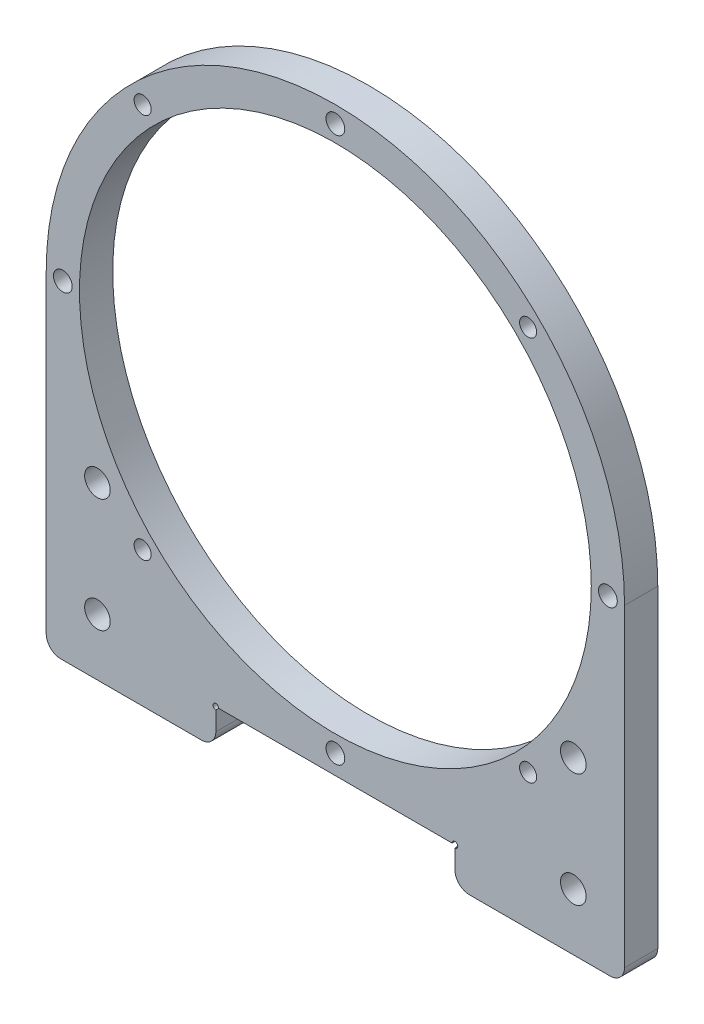
ISO-10303-21;
HEADER;
FILE_DESCRIPTION(('STEP AP214'),'2;1');
FILE_NAME('part.step','',(''),(''),'','','');
FILE_SCHEMA(('AUTOMOTIVE_DESIGN { 1 0 10303 214 1 1 1 1 }'));
ENDSEC;
DATA;
#1=APPLICATION_CONTEXT('core data for automotive mechanical design processes');
#2=APPLICATION_PROTOCOL_DEFINITION('international standard','automotive_design',2000,#1);
#3=PRODUCT_CONTEXT('',#1,'mechanical');
#4=PRODUCT('Part','Part','',(#3));
#5=PRODUCT_RELATED_PRODUCT_CATEGORY('part','',(#4));
#6=PRODUCT_DEFINITION_FORMATION('','',#4);
#7=PRODUCT_DEFINITION_CONTEXT('part definition',#1,'design');
#8=PRODUCT_DEFINITION('design','',#6,#7);
#9=PRODUCT_DEFINITION_SHAPE('','',#8);
#10=(LENGTH_UNIT() NAMED_UNIT(*) SI_UNIT(.MILLI.,.METRE.));
#11=(NAMED_UNIT(*) PLANE_ANGLE_UNIT() SI_UNIT($,.RADIAN.));
#12=(NAMED_UNIT(*) SI_UNIT($,.STERADIAN.) SOLID_ANGLE_UNIT());
#13=UNCERTAINTY_MEASURE_WITH_UNIT(LENGTH_MEASURE(1.E-05),#10,'distance_accuracy_value','');
#14=(GEOMETRIC_REPRESENTATION_CONTEXT(3) GLOBAL_UNCERTAINTY_ASSIGNED_CONTEXT((#13)) GLOBAL_UNIT_ASSIGNED_CONTEXT((#10,
#11,#12)) REPRESENTATION_CONTEXT('',''));
#15=CARTESIAN_POINT('',(0.,0.,0.));
#16=DIRECTION('',(0.,0.,1.));
#17=DIRECTION('',(1.,0.,0.));
#18=AXIS2_PLACEMENT_3D('',#15,#16,#17);
#19=CARTESIAN_POINT('',(0.,-57.658,5.842));
#20=DIRECTION('',(0.,1.,0.));
#21=DIRECTION('',(-1.,0.,0.));
#22=AXIS2_PLACEMENT_3D('',#19,#20,#21);
#23=PLANE('',#22);
#24=DIRECTION('',(1.,0.,0.));
#25=VECTOR('',#24,1.);
#26=CARTESIAN_POINT('',(0.,-57.658,0.));
#27=LINE('',#26,#25);
#28=CARTESIAN_POINT('',(-48.26,-57.658,0.));
#29=VERTEX_POINT('',#28);
#30=CARTESIAN_POINT('',(-23.54,-57.658,0.));
#31=VERTEX_POINT('',#30);
#32=EDGE_CURVE('E263',#29,#31,#27,.T.);
#33=ORIENTED_EDGE('',*,*,#32,.T.);
#34=DIRECTION('',(0.,0.,1.));
#35=VECTOR('',#34,1.);
#36=CARTESIAN_POINT('',(-23.54,-57.658,5.842));
#37=LINE('',#36,#35);
#38=CARTESIAN_POINT('',(-23.54,-57.658,5.842));
#39=VERTEX_POINT('',#38);
#40=EDGE_CURVE('E309',#31,#39,#37,.T.);
#41=ORIENTED_EDGE('',*,*,#40,.T.);
#42=DIRECTION('',(1.,0.,0.));
#43=VECTOR('',#42,1.);
#44=CARTESIAN_POINT('',(0.,-57.658,5.842));
#45=LINE('',#44,#43);
#46=CARTESIAN_POINT('',(-48.26,-57.658,5.842));
#47=VERTEX_POINT('',#46);
#48=EDGE_CURVE('E209',#47,#39,#45,.T.);
#49=ORIENTED_EDGE('',*,*,#48,.F.);
#50=DIRECTION('',(0.,0.,-1.));
#51=VECTOR('',#50,1.);
#52=CARTESIAN_POINT('',(-48.26,-57.658,5.842));
#53=LINE('',#52,#51);
#54=EDGE_CURVE('E306',#47,#29,#53,.T.);
#55=ORIENTED_EDGE('',*,*,#54,.T.);
#56=EDGE_LOOP('',(#33,#41,#49,#55));
#57=FACE_BOUND('',#56,.T.);
#58=ADVANCED_FACE('F35',(#57),#23,.F.);
#59=CARTESIAN_POINT('',(0.,0.,5.842));
#60=DIRECTION('',(0.,0.,-1.));
#61=DIRECTION('',(-1.,0.,0.));
#62=AXIS2_PLACEMENT_3D('',#59,#60,#61);
#63=CYLINDRICAL_SURFACE('',#62,50.8);
#64=CARTESIAN_POINT('',(0.,0.,0.));
#65=DIRECTION('',(0.,0.,1.));
#66=DIRECTION('',(1.,0.,0.));
#67=AXIS2_PLACEMENT_3D('',#64,#65,#66);
#68=CIRCLE('',#67,50.8);
#69=CARTESIAN_POINT('',(-50.8,0.,0.));
#70=VERTEX_POINT('',#69);
#71=CARTESIAN_POINT('',(50.8,0.,0.));
#72=VERTEX_POINT('',#71);
#73=EDGE_CURVE('E254',#70,#72,#68,.F.);
#74=ORIENTED_EDGE('',*,*,#73,.F.);
#75=DIRECTION('',(0.,0.,-1.));
#76=VECTOR('',#75,1.);
#77=CARTESIAN_POINT('',(-50.8,0.,5.842));
#78=LINE('',#77,#76);
#79=CARTESIAN_POINT('',(-50.8,0.,5.842));
#80=VERTEX_POINT('',#79);
#81=EDGE_CURVE('E276',#80,#70,#78,.T.);
#82=ORIENTED_EDGE('',*,*,#81,.F.);
#83=CARTESIAN_POINT('',(0.,0.,5.842));
#84=DIRECTION('',(0.,0.,1.));
#85=DIRECTION('',(1.,0.,0.));
#86=AXIS2_PLACEMENT_3D('',#83,#84,#85);
#87=CIRCLE('',#86,50.8);
#88=CARTESIAN_POINT('',(50.8,0.,5.842));
#89=VERTEX_POINT('',#88);
#90=EDGE_CURVE('E202',#80,#89,#87,.F.);
#91=ORIENTED_EDGE('',*,*,#90,.T.);
#92=DIRECTION('',(0.,0.,-1.));
#93=VECTOR('',#92,1.);
#94=CARTESIAN_POINT('',(50.8,0.,5.842));
#95=LINE('',#94,#93);
#96=EDGE_CURVE('E223',#89,#72,#95,.T.);
#97=ORIENTED_EDGE('',*,*,#96,.T.);
#98=EDGE_LOOP('',(#74,#82,#91,#97));
#99=FACE_BOUND('',#98,.T.);
#100=ADVANCED_FACE('F337',(#99),#63,.T.);
#101=CARTESIAN_POINT('',(-50.8,0.,5.842));
#102=DIRECTION('',(1.,0.,0.));
#103=DIRECTION('',(0.,1.,0.));
#104=AXIS2_PLACEMENT_3D('',#101,#102,#103);
#105=PLANE('',#104);
#106=DIRECTION('',(0.,-1.,0.));
#107=VECTOR('',#106,1.);
#108=CARTESIAN_POINT('',(-50.8,0.,0.));
#109=LINE('',#108,#107);
#110=CARTESIAN_POINT('',(-50.8,-55.118,0.));
#111=VERTEX_POINT('',#110);
#112=EDGE_CURVE('E257',#70,#111,#109,.T.);
#113=ORIENTED_EDGE('',*,*,#112,.T.);
#114=DIRECTION('',(0.,0.,-1.));
#115=VECTOR('',#114,1.);
#116=CARTESIAN_POINT('',(-50.8,-55.118,5.842));
#117=LINE('',#116,#115);
#118=CARTESIAN_POINT('',(-50.8,-55.118,5.842));
#119=VERTEX_POINT('',#118);
#120=EDGE_CURVE('E11',#111,#119,#117,.F.);
#121=ORIENTED_EDGE('',*,*,#120,.T.);
#122=DIRECTION('',(0.,-1.,0.));
#123=VECTOR('',#122,1.);
#124=CARTESIAN_POINT('',(-50.8,0.,5.842));
#125=LINE('',#124,#123);
#126=EDGE_CURVE('E205',#80,#119,#125,.T.);
#127=ORIENTED_EDGE('',*,*,#126,.F.);
#128=ORIENTED_EDGE('',*,*,#81,.T.);
#129=EDGE_LOOP('',(#113,#121,#127,#128));
#130=FACE_BOUND('',#129,.T.);
#131=ADVANCED_FACE('F335',(#130),#105,.F.);
#132=CARTESIAN_POINT('',(23.54,-57.658,0.));
#133=VERTEX_POINT('',#132);
#134=CARTESIAN_POINT('',(48.26,-57.658,0.));
#135=VERTEX_POINT('',#134);
#136=EDGE_CURVE('E260',#133,#135,#27,.T.);
#137=ORIENTED_EDGE('',*,*,#136,.T.);
#138=DIRECTION('',(0.,0.,-1.));
#139=VECTOR('',#138,1.);
#140=CARTESIAN_POINT('',(48.26,-57.658,5.842));
#141=LINE('',#140,#139);
#142=CARTESIAN_POINT('',(48.26,-57.658,5.842));
#143=VERTEX_POINT('',#142);
#144=EDGE_CURVE('E294',#135,#143,#141,.F.);
#145=ORIENTED_EDGE('',*,*,#144,.T.);
#146=CARTESIAN_POINT('',(23.54,-57.658,5.842));
#147=VERTEX_POINT('',#146);
#148=EDGE_CURVE('E208',#147,#143,#45,.T.);
#149=ORIENTED_EDGE('',*,*,#148,.F.);
#150=DIRECTION('',(0.,0.,1.));
#151=VECTOR('',#150,1.);
#152=CARTESIAN_POINT('',(23.54,-57.658,5.842));
#153=LINE('',#152,#151);
#154=EDGE_CURVE('E292',#147,#133,#153,.F.);
#155=ORIENTED_EDGE('',*,*,#154,.T.);
#156=EDGE_LOOP('',(#137,#145,#149,#155));
#157=FACE_BOUND('',#156,.T.);
#158=ADVANCED_FACE('F350',(#157),#23,.F.);
#159=CARTESIAN_POINT('',(0.,47.879,5.842));
#160=DIRECTION('',(0.,0.,-1.));
#161=DIRECTION('',(-1.,0.,0.));
#162=AXIS2_PLACEMENT_3D('',#159,#160,#161);
#163=CYLINDRICAL_SURFACE('',#162,1.65);
#164=CARTESIAN_POINT('',(0.,47.879,5.842));
#165=DIRECTION('',(0.,0.,1.));
#166=DIRECTION('',(1.,0.,0.));
#167=AXIS2_PLACEMENT_3D('',#164,#165,#166);
#168=CIRCLE('',#167,1.65);
#169=CARTESIAN_POINT('',(1.65,47.879,5.842));
#170=VERTEX_POINT('',#169);
#171=EDGE_CURVE('E217',#170,#170,#168,.T.);
#172=ORIENTED_EDGE('',*,*,#171,.T.);
#173=EDGE_LOOP('',(#172));
#174=FACE_BOUND('',#173,.T.);
#175=CARTESIAN_POINT('',(0.,47.879,0.));
#176=DIRECTION('',(0.,0.,1.));
#177=DIRECTION('',(1.,0.,0.));
#178=AXIS2_PLACEMENT_3D('',#175,#176,#177);
#179=CIRCLE('',#178,1.65);
#180=CARTESIAN_POINT('',(1.65,47.879,0.));
#181=VERTEX_POINT('',#180);
#182=EDGE_CURVE('E270',#181,#181,#179,.T.);
#183=ORIENTED_EDGE('',*,*,#182,.F.);
#184=EDGE_LOOP('',(#183));
#185=FACE_BOUND('',#184,.T.);
#186=ADVANCED_FACE('F389',(#174,#185),#163,.F.);
#187=CARTESIAN_POINT('',(-47.879,0.,5.842));
#188=DIRECTION('',(0.,0.,-1.));
#189=DIRECTION('',(-1.,0.,0.));
#190=AXIS2_PLACEMENT_3D('',#187,#188,#189);
#191=CYLINDRICAL_SURFACE('',#190,1.65000000000001);
#192=CARTESIAN_POINT('',(-47.879,0.,5.842));
#193=DIRECTION('',(0.,0.,1.));
#194=DIRECTION('',(1.,0.,0.));
#195=AXIS2_PLACEMENT_3D('',#192,#193,#194);
#196=CIRCLE('',#195,1.65000000000001);
#197=CARTESIAN_POINT('',(-46.229,0.,5.842));
#198=VERTEX_POINT('',#197);
#199=EDGE_CURVE('E214',#198,#198,#196,.T.);
#200=ORIENTED_EDGE('',*,*,#199,.T.);
#201=EDGE_LOOP('',(#200));
#202=FACE_BOUND('',#201,.T.);
#203=CARTESIAN_POINT('',(-47.879,0.,0.));
#204=DIRECTION('',(0.,0.,1.));
#205=DIRECTION('',(1.,0.,0.));
#206=AXIS2_PLACEMENT_3D('',#203,#204,#205);
#207=CIRCLE('',#206,1.65000000000001);
#208=CARTESIAN_POINT('',(-46.229,0.,0.));
#209=VERTEX_POINT('',#208);
#210=EDGE_CURVE('E267',#209,#209,#207,.T.);
#211=ORIENTED_EDGE('',*,*,#210,.F.);
#212=EDGE_LOOP('',(#211));
#213=FACE_BOUND('',#212,.T.);
#214=ADVANCED_FACE('F394',(#202,#213),#191,.F.);
#215=CARTESIAN_POINT('',(50.8,0.,5.842));
#216=DIRECTION('',(1.,0.,0.));
#217=DIRECTION('',(0.,1.,0.));
#218=AXIS2_PLACEMENT_3D('',#215,#216,#217);
#219=PLANE('',#218);
#220=DIRECTION('',(0.,-1.,0.));
#221=VECTOR('',#220,1.);
#222=CARTESIAN_POINT('',(50.8,0.,5.842));
#223=LINE('',#222,#221);
#224=CARTESIAN_POINT('',(50.8,-55.118,5.842));
#225=VERTEX_POINT('',#224);
#226=EDGE_CURVE('E211',#89,#225,#223,.T.);
#227=ORIENTED_EDGE('',*,*,#226,.T.);
#228=DIRECTION('',(0.,0.,-1.));
#229=VECTOR('',#228,1.);
#230=CARTESIAN_POINT('',(50.8,-55.118,0.));
#231=LINE('',#230,#229);
#232=CARTESIAN_POINT('',(50.8,-55.118,0.));
#233=VERTEX_POINT('',#232);
#234=EDGE_CURVE('E281',#225,#233,#231,.T.);
#235=ORIENTED_EDGE('',*,*,#234,.T.);
#236=DIRECTION('',(0.,-1.,0.));
#237=VECTOR('',#236,1.);
#238=CARTESIAN_POINT('',(50.8,0.,0.));
#239=LINE('',#238,#237);
#240=EDGE_CURVE('E264',#72,#233,#239,.T.);
#241=ORIENTED_EDGE('',*,*,#240,.F.);
#242=ORIENTED_EDGE('',*,*,#96,.F.);
#243=EDGE_LOOP('',(#227,#235,#241,#242));
#244=FACE_BOUND('',#243,.T.);
#245=ADVANCED_FACE('F341',(#244),#219,.T.);
#246=CARTESIAN_POINT('',(0.,0.,5.842));
#247=DIRECTION('',(0.,0.,-1.));
#248=DIRECTION('',(-1.,0.,0.));
#249=AXIS2_PLACEMENT_3D('',#246,#247,#248);
#250=CYLINDRICAL_SURFACE('',#249,44.958);
#251=CARTESIAN_POINT('',(0.,0.,5.842));
#252=DIRECTION('',(0.,0.,1.));
#253=DIRECTION('',(1.,0.,0.));
#254=AXIS2_PLACEMENT_3D('',#251,#252,#253);
#255=CIRCLE('',#254,44.958);
#256=CARTESIAN_POINT('',(44.958,0.,5.842));
#257=VERTEX_POINT('',#256);
#258=EDGE_CURVE('E199',#257,#257,#255,.T.);
#259=ORIENTED_EDGE('',*,*,#258,.T.);
#260=EDGE_LOOP('',(#259));
#261=FACE_BOUND('',#260,.T.);
#262=CARTESIAN_POINT('',(0.,0.,0.));
#263=DIRECTION('',(0.,0.,1.));
#264=DIRECTION('',(1.,0.,0.));
#265=AXIS2_PLACEMENT_3D('',#262,#263,#264);
#266=CIRCLE('',#265,44.958);
#267=CARTESIAN_POINT('',(44.958,0.,0.));
#268=VERTEX_POINT('',#267);
#269=EDGE_CURVE('E251',#268,#268,#266,.T.);
#270=ORIENTED_EDGE('',*,*,#269,.F.);
#271=EDGE_LOOP('',(#270));
#272=FACE_BOUND('',#271,.T.);
#273=ADVANCED_FACE('F400',(#261,#272),#250,.F.);
#274=CARTESIAN_POINT('',(41.8,-47.658,5.842));
#275=DIRECTION('',(0.,0.,-1.));
#276=DIRECTION('',(-1.,0.,0.));
#277=AXIS2_PLACEMENT_3D('',#274,#275,#276);
#278=CYLINDRICAL_SURFACE('',#277,2.25);
#279=CARTESIAN_POINT('',(41.8,-47.658,5.842));
#280=DIRECTION('',(0.,0.,1.));
#281=DIRECTION('',(1.,0.,0.));
#282=AXIS2_PLACEMENT_3D('',#279,#280,#281);
#283=CIRCLE('',#282,2.25);
#284=CARTESIAN_POINT('',(44.05,-47.658,5.842));
#285=VERTEX_POINT('',#284);
#286=EDGE_CURVE('E196',#285,#285,#283,.F.);
#287=ORIENTED_EDGE('',*,*,#286,.F.);
#288=EDGE_LOOP('',(#287));
#289=FACE_BOUND('',#288,.T.);
#290=CARTESIAN_POINT('',(41.8,-47.658,0.));
#291=DIRECTION('',(0.,0.,1.));
#292=DIRECTION('',(1.,0.,0.));
#293=AXIS2_PLACEMENT_3D('',#290,#291,#292);
#294=CIRCLE('',#293,2.25);
#295=CARTESIAN_POINT('',(44.05,-47.658,0.));
#296=VERTEX_POINT('',#295);
#297=EDGE_CURVE('E248',#296,#296,#294,.F.);
#298=ORIENTED_EDGE('',*,*,#297,.T.);
#299=EDGE_LOOP('',(#298));
#300=FACE_BOUND('',#299,.T.);
#301=ADVANCED_FACE('F403',(#289,#300),#278,.F.);
#302=CARTESIAN_POINT('',(47.879,0.,5.842));
#303=DIRECTION('',(0.,0.,-1.));
#304=DIRECTION('',(-1.,0.,0.));
#305=AXIS2_PLACEMENT_3D('',#302,#303,#304);
#306=CYLINDRICAL_SURFACE('',#305,1.65);
#307=CARTESIAN_POINT('',(47.879,0.,5.842));
#308=DIRECTION('',(0.,0.,1.));
#309=DIRECTION('',(1.,0.,0.));
#310=AXIS2_PLACEMENT_3D('',#307,#308,#309);
#311=CIRCLE('',#310,1.65);
#312=CARTESIAN_POINT('',(49.529,0.,5.842));
#313=VERTEX_POINT('',#312);
#314=EDGE_CURVE('E193',#313,#313,#311,.T.);
#315=ORIENTED_EDGE('',*,*,#314,.T.);
#316=EDGE_LOOP('',(#315));
#317=FACE_BOUND('',#316,.T.);
#318=CARTESIAN_POINT('',(47.879,0.,0.));
#319=DIRECTION('',(0.,0.,1.));
#320=DIRECTION('',(1.,0.,0.));
#321=AXIS2_PLACEMENT_3D('',#318,#319,#320);
#322=CIRCLE('',#321,1.65);
#323=CARTESIAN_POINT('',(49.529,0.,0.));
#324=VERTEX_POINT('',#323);
#325=EDGE_CURVE('E245',#324,#324,#322,.T.);
#326=ORIENTED_EDGE('',*,*,#325,.F.);
#327=EDGE_LOOP('',(#326));
#328=FACE_BOUND('',#327,.T.);
#329=ADVANCED_FACE('F407',(#317,#328),#306,.F.);
#330=CARTESIAN_POINT('',(0.,-47.879,5.842));
#331=DIRECTION('',(0.,0.,-1.));
#332=DIRECTION('',(-1.,0.,0.));
#333=AXIS2_PLACEMENT_3D('',#330,#331,#332);
#334=CYLINDRICAL_SURFACE('',#333,1.65);
#335=CARTESIAN_POINT('',(0.,-47.879,5.842));
#336=DIRECTION('',(0.,0.,1.));
#337=DIRECTION('',(1.,0.,0.));
#338=AXIS2_PLACEMENT_3D('',#335,#336,#337);
#339=CIRCLE('',#338,1.65);
#340=CARTESIAN_POINT('',(1.65000000000001,-47.879,5.842));
#341=VERTEX_POINT('',#340);
#342=EDGE_CURVE('E190',#341,#341,#339,.T.);
#343=ORIENTED_EDGE('',*,*,#342,.T.);
#344=EDGE_LOOP('',(#343));
#345=FACE_BOUND('',#344,.T.);
#346=CARTESIAN_POINT('',(0.,-47.879,0.));
#347=DIRECTION('',(0.,0.,1.));
#348=DIRECTION('',(1.,0.,0.));
#349=AXIS2_PLACEMENT_3D('',#346,#347,#348);
#350=CIRCLE('',#349,1.65);
#351=CARTESIAN_POINT('',(1.65000000000001,-47.879,0.));
#352=VERTEX_POINT('',#351);
#353=EDGE_CURVE('E242',#352,#352,#350,.T.);
#354=ORIENTED_EDGE('',*,*,#353,.F.);
#355=EDGE_LOOP('',(#354));
#356=FACE_BOUND('',#355,.T.);
#357=ADVANCED_FACE('F411',(#345,#356),#334,.F.);
#358=CARTESIAN_POINT('',(-41.8,-27.658,5.842));
#359=DIRECTION('',(0.,0.,-1.));
#360=DIRECTION('',(-1.,0.,0.));
#361=AXIS2_PLACEMENT_3D('',#358,#359,#360);
#362=CYLINDRICAL_SURFACE('',#361,2.25);
#363=CARTESIAN_POINT('',(-41.8,-27.658,5.842));
#364=DIRECTION('',(0.,0.,1.));
#365=DIRECTION('',(1.,0.,0.));
#366=AXIS2_PLACEMENT_3D('',#363,#364,#365);
#367=CIRCLE('',#366,2.25);
#368=CARTESIAN_POINT('',(-39.55,-27.658,5.842));
#369=VERTEX_POINT('',#368);
#370=EDGE_CURVE('E187',#369,#369,#367,.T.);
#371=ORIENTED_EDGE('',*,*,#370,.T.);
#372=EDGE_LOOP('',(#371));
#373=FACE_BOUND('',#372,.T.);
#374=CARTESIAN_POINT('',(-41.8,-27.658,0.));
#375=DIRECTION('',(0.,0.,1.));
#376=DIRECTION('',(1.,0.,0.));
#377=AXIS2_PLACEMENT_3D('',#374,#375,#376);
#378=CIRCLE('',#377,2.25);
#379=CARTESIAN_POINT('',(-39.55,-27.658,0.));
#380=VERTEX_POINT('',#379);
#381=EDGE_CURVE('E239',#380,#380,#378,.T.);
#382=ORIENTED_EDGE('',*,*,#381,.F.);
#383=EDGE_LOOP('',(#382));
#384=FACE_BOUND('',#383,.T.);
#385=ADVANCED_FACE('F415',(#373,#384),#362,.F.);
#386=CARTESIAN_POINT('',(-33.8555655764305,33.8555655764309,5.842));
#387=DIRECTION('',(0.,0.,-1.));
#388=DIRECTION('',(-1.,0.,0.));
#389=AXIS2_PLACEMENT_3D('',#386,#387,#388);
#390=CYLINDRICAL_SURFACE('',#389,1.50000000000001);
#391=CARTESIAN_POINT('',(-33.8555655764305,33.8555655764309,5.842));
#392=DIRECTION('',(0.,0.,1.));
#393=DIRECTION('',(1.,0.,0.));
#394=AXIS2_PLACEMENT_3D('',#391,#392,#393);
#395=CIRCLE('',#394,1.50000000000001);
#396=CARTESIAN_POINT('',(-32.3555655764305,33.8555655764309,5.842));
#397=VERTEX_POINT('',#396);
#398=EDGE_CURVE('E184',#397,#397,#395,.T.);
#399=ORIENTED_EDGE('',*,*,#398,.T.);
#400=EDGE_LOOP('',(#399));
#401=FACE_BOUND('',#400,.T.);
#402=CARTESIAN_POINT('',(-33.8555655764305,33.8555655764309,0.));
#403=DIRECTION('',(0.,0.,1.));
#404=DIRECTION('',(1.,0.,0.));
#405=AXIS2_PLACEMENT_3D('',#402,#403,#404);
#406=CIRCLE('',#405,1.50000000000001);
#407=CARTESIAN_POINT('',(-32.3555655764305,33.8555655764309,0.));
#408=VERTEX_POINT('',#407);
#409=EDGE_CURVE('E236',#408,#408,#406,.T.);
#410=ORIENTED_EDGE('',*,*,#409,.F.);
#411=EDGE_LOOP('',(#410));
#412=FACE_BOUND('',#411,.T.);
#413=ADVANCED_FACE('F419',(#401,#412),#390,.F.);
#414=CARTESIAN_POINT('',(33.8555655764309,33.8555655764305,5.842));
#415=DIRECTION('',(0.,0.,-1.));
#416=DIRECTION('',(-1.,0.,0.));
#417=AXIS2_PLACEMENT_3D('',#414,#415,#416);
#418=CYLINDRICAL_SURFACE('',#417,1.5);
#419=CARTESIAN_POINT('',(33.8555655764309,33.8555655764305,5.842));
#420=DIRECTION('',(0.,0.,1.));
#421=DIRECTION('',(1.,0.,0.));
#422=AXIS2_PLACEMENT_3D('',#419,#420,#421);
#423=CIRCLE('',#422,1.5);
#424=CARTESIAN_POINT('',(35.3555655764309,33.8555655764305,5.842));
#425=VERTEX_POINT('',#424);
#426=EDGE_CURVE('E181',#425,#425,#423,.T.);
#427=ORIENTED_EDGE('',*,*,#426,.T.);
#428=EDGE_LOOP('',(#427));
#429=FACE_BOUND('',#428,.T.);
#430=CARTESIAN_POINT('',(33.8555655764309,33.8555655764305,0.));
#431=DIRECTION('',(0.,0.,1.));
#432=DIRECTION('',(1.,0.,0.));
#433=AXIS2_PLACEMENT_3D('',#430,#431,#432);
#434=CIRCLE('',#433,1.5);
#435=CARTESIAN_POINT('',(35.3555655764309,33.8555655764305,0.));
#436=VERTEX_POINT('',#435);
#437=EDGE_CURVE('E233',#436,#436,#434,.T.);
#438=ORIENTED_EDGE('',*,*,#437,.F.);
#439=EDGE_LOOP('',(#438));
#440=FACE_BOUND('',#439,.T.);
#441=ADVANCED_FACE('F423',(#429,#440),#418,.F.);
#442=CARTESIAN_POINT('',(33.8555655764305,-33.8555655764309,5.842));
#443=DIRECTION('',(0.,0.,-1.));
#444=DIRECTION('',(-1.,0.,0.));
#445=AXIS2_PLACEMENT_3D('',#442,#443,#444);
#446=CYLINDRICAL_SURFACE('',#445,1.50000000000001);
#447=CARTESIAN_POINT('',(33.8555655764305,-33.8555655764309,5.842));
#448=DIRECTION('',(0.,0.,1.));
#449=DIRECTION('',(1.,0.,0.));
#450=AXIS2_PLACEMENT_3D('',#447,#448,#449);
#451=CIRCLE('',#450,1.50000000000001);
#452=CARTESIAN_POINT('',(35.3555655764305,-33.8555655764309,5.842));
#453=VERTEX_POINT('',#452);
#454=EDGE_CURVE('E178',#453,#453,#451,.T.);
#455=ORIENTED_EDGE('',*,*,#454,.T.);
#456=EDGE_LOOP('',(#455));
#457=FACE_BOUND('',#456,.T.);
#458=CARTESIAN_POINT('',(33.8555655764305,-33.8555655764309,0.));
#459=DIRECTION('',(0.,0.,1.));
#460=DIRECTION('',(1.,0.,0.));
#461=AXIS2_PLACEMENT_3D('',#458,#459,#460);
#462=CIRCLE('',#461,1.50000000000001);
#463=CARTESIAN_POINT('',(35.3555655764305,-33.8555655764309,0.));
#464=VERTEX_POINT('',#463);
#465=EDGE_CURVE('E230',#464,#464,#462,.T.);
#466=ORIENTED_EDGE('',*,*,#465,.F.);
#467=EDGE_LOOP('',(#466));
#468=FACE_BOUND('',#467,.T.);
#469=ADVANCED_FACE('F427',(#457,#468),#446,.F.);
#470=CARTESIAN_POINT('',(-33.8555655764309,-33.8555655764305,5.842));
#471=DIRECTION('',(0.,0.,-1.));
#472=DIRECTION('',(-1.,0.,0.));
#473=AXIS2_PLACEMENT_3D('',#470,#471,#472);
#474=CYLINDRICAL_SURFACE('',#473,1.50000000000001);
#475=CARTESIAN_POINT('',(-33.8555655764309,-33.8555655764305,5.842));
#476=DIRECTION('',(0.,0.,1.));
#477=DIRECTION('',(1.,0.,0.));
#478=AXIS2_PLACEMENT_3D('',#475,#476,#477);
#479=CIRCLE('',#478,1.50000000000001);
#480=CARTESIAN_POINT('',(-32.3555655764309,-33.8555655764305,5.842));
#481=VERTEX_POINT('',#480);
#482=EDGE_CURVE('E174',#481,#481,#479,.T.);
#483=ORIENTED_EDGE('',*,*,#482,.T.);
#484=EDGE_LOOP('',(#483));
#485=FACE_BOUND('',#484,.T.);
#486=CARTESIAN_POINT('',(-33.8555655764309,-33.8555655764305,0.));
#487=DIRECTION('',(0.,0.,1.));
#488=DIRECTION('',(1.,0.,0.));
#489=AXIS2_PLACEMENT_3D('',#486,#487,#488);
#490=CIRCLE('',#489,1.50000000000001);
#491=CARTESIAN_POINT('',(-32.3555655764309,-33.8555655764305,0.));
#492=VERTEX_POINT('',#491);
#493=EDGE_CURVE('E227',#492,#492,#490,.T.);
#494=ORIENTED_EDGE('',*,*,#493,.F.);
#495=EDGE_LOOP('',(#494));
#496=FACE_BOUND('',#495,.T.);
#497=ADVANCED_FACE('F431',(#485,#496),#474,.F.);
#498=CARTESIAN_POINT('',(-41.8,-47.658,5.842));
#499=DIRECTION('',(0.,0.,-1.));
#500=DIRECTION('',(-1.,0.,0.));
#501=AXIS2_PLACEMENT_3D('',#498,#499,#500);
#502=CYLINDRICAL_SURFACE('',#501,2.25);
#503=CARTESIAN_POINT('',(-41.8,-47.658,5.842));
#504=DIRECTION('',(0.,0.,1.));
#505=DIRECTION('',(1.,0.,0.));
#506=AXIS2_PLACEMENT_3D('',#503,#504,#505);
#507=CIRCLE('',#506,2.25);
#508=CARTESIAN_POINT('',(-39.55,-47.658,5.842));
#509=VERTEX_POINT('',#508);
#510=EDGE_CURVE('E171',#509,#509,#507,.T.);
#511=ORIENTED_EDGE('',*,*,#510,.T.);
#512=EDGE_LOOP('',(#511));
#513=FACE_BOUND('',#512,.T.);
#514=CARTESIAN_POINT('',(-41.8,-47.658,0.));
#515=DIRECTION('',(0.,0.,1.));
#516=DIRECTION('',(1.,0.,0.));
#517=AXIS2_PLACEMENT_3D('',#514,#515,#516);
#518=CIRCLE('',#517,2.25);
#519=CARTESIAN_POINT('',(-39.55,-47.658,0.));
#520=VERTEX_POINT('',#519);
#521=EDGE_CURVE('E224',#520,#520,#518,.T.);
#522=ORIENTED_EDGE('',*,*,#521,.F.);
#523=EDGE_LOOP('',(#522));
#524=FACE_BOUND('',#523,.T.);
#525=ADVANCED_FACE('F435',(#513,#524),#502,.F.);
#526=CARTESIAN_POINT('',(41.8,-27.658,5.842));
#527=DIRECTION('',(0.,0.,-1.));
#528=DIRECTION('',(-1.,0.,0.));
#529=AXIS2_PLACEMENT_3D('',#526,#527,#528);
#530=CYLINDRICAL_SURFACE('',#529,2.25);
#531=CARTESIAN_POINT('',(41.8,-27.658,5.842));
#532=DIRECTION('',(0.,0.,1.));
#533=DIRECTION('',(1.,0.,0.));
#534=AXIS2_PLACEMENT_3D('',#531,#532,#533);
#535=CIRCLE('',#534,2.25);
#536=CARTESIAN_POINT('',(44.05,-27.658,5.842));
#537=VERTEX_POINT('',#536);
#538=EDGE_CURVE('E220',#537,#537,#535,.F.);
#539=ORIENTED_EDGE('',*,*,#538,.F.);
#540=EDGE_LOOP('',(#539));
#541=FACE_BOUND('',#540,.T.);
#542=CARTESIAN_POINT('',(41.8,-27.658,0.));
#543=DIRECTION('',(0.,0.,1.));
#544=DIRECTION('',(1.,0.,0.));
#545=AXIS2_PLACEMENT_3D('',#542,#543,#544);
#546=CIRCLE('',#545,2.25);
#547=CARTESIAN_POINT('',(44.05,-27.658,0.));
#548=VERTEX_POINT('',#547);
#549=EDGE_CURVE('E175',#548,#548,#546,.F.);
#550=ORIENTED_EDGE('',*,*,#549,.T.);
#551=EDGE_LOOP('',(#550));
#552=FACE_BOUND('',#551,.T.);
#553=ADVANCED_FACE('F439',(#541,#552),#530,.F.);
#554=CARTESIAN_POINT('',(0.,0.,5.842));
#555=DIRECTION('',(0.,0.,1.));
#556=DIRECTION('',(1.,0.,0.));
#557=AXIS2_PLACEMENT_3D('',#554,#555,#556);
#558=PLANE('',#557);
#559=ORIENTED_EDGE('',*,*,#148,.T.);
#560=CARTESIAN_POINT('',(48.26,-55.118,5.842));
#561=DIRECTION('',(0.,0.,1.));
#562=DIRECTION('',(1.,0.,0.));
#563=AXIS2_PLACEMENT_3D('',#560,#561,#562);
#564=CIRCLE('',#563,2.54);
#565=EDGE_CURVE('E301',#143,#225,#564,.T.);
#566=ORIENTED_EDGE('',*,*,#565,.T.);
#567=ORIENTED_EDGE('',*,*,#226,.F.);
#568=ORIENTED_EDGE('',*,*,#90,.F.);
#569=ORIENTED_EDGE('',*,*,#126,.T.);
#570=CARTESIAN_POINT('',(-48.26,-55.118,5.842));
#571=DIRECTION('',(0.,0.,1.));
#572=DIRECTION('',(1.,0.,0.));
#573=AXIS2_PLACEMENT_3D('',#570,#571,#572);
#574=CIRCLE('',#573,2.54);
#575=EDGE_CURVE('E296',#119,#47,#574,.T.);
#576=ORIENTED_EDGE('',*,*,#575,.T.);
#577=ORIENTED_EDGE('',*,*,#48,.T.);
#578=CARTESIAN_POINT('',(-23.54,-55.118,5.842));
#579=DIRECTION('',(0.,0.,1.));
#580=DIRECTION('',(1.,0.,0.));
#581=AXIS2_PLACEMENT_3D('',#578,#579,#580);
#582=CIRCLE('',#581,2.54);
#583=CARTESIAN_POINT('',(-21.,-55.118,5.842));
#584=VERTEX_POINT('',#583);
#585=EDGE_CURVE('E50',#39,#584,#582,.T.);
#586=ORIENTED_EDGE('',*,*,#585,.T.);
#587=DIRECTION('',(0.,-1.,0.));
#588=VECTOR('',#587,1.);
#589=CARTESIAN_POINT('',(-21.,-57.658,5.842));
#590=LINE('',#589,#588);
#591=CARTESIAN_POINT('',(-21.,-51.808,5.842));
#592=VERTEX_POINT('',#591);
#593=EDGE_CURVE('E167',#592,#584,#590,.T.);
#594=ORIENTED_EDGE('',*,*,#593,.F.);
#595=CARTESIAN_POINT('',(-21.,-51.308,5.842));
#596=DIRECTION('',(0.,0.,1.));
#597=DIRECTION('',(1.,0.,0.));
#598=AXIS2_PLACEMENT_3D('',#595,#596,#597);
#599=CIRCLE('',#598,0.499999999999999);
#600=CARTESIAN_POINT('',(-20.5,-51.308,5.842));
#601=VERTEX_POINT('',#600);
#602=EDGE_CURVE('E155',#601,#592,#599,.T.);
#603=ORIENTED_EDGE('',*,*,#602,.F.);
#604=DIRECTION('',(-1.,0.,0.));
#605=VECTOR('',#604,1.);
#606=CARTESIAN_POINT('',(-21.,-51.308,5.842));
#607=LINE('',#606,#605);
#608=CARTESIAN_POINT('',(20.5,-51.308,5.842));
#609=VERTEX_POINT('',#608);
#610=EDGE_CURVE('E152',#609,#601,#607,.T.);
#611=ORIENTED_EDGE('',*,*,#610,.F.);
#612=CARTESIAN_POINT('',(21.,-51.308,5.842));
#613=DIRECTION('',(0.,0.,1.));
#614=DIRECTION('',(1.,0.,0.));
#615=AXIS2_PLACEMENT_3D('',#612,#613,#614);
#616=CIRCLE('',#615,0.499999999999999);
#617=CARTESIAN_POINT('',(21.,-51.808,5.842));
#618=VERTEX_POINT('',#617);
#619=EDGE_CURVE('E136',#618,#609,#616,.T.);
#620=ORIENTED_EDGE('',*,*,#619,.F.);
#621=DIRECTION('',(0.,1.,0.));
#622=VECTOR('',#621,1.);
#623=CARTESIAN_POINT('',(21.,-57.658,5.842));
#624=LINE('',#623,#622);
#625=CARTESIAN_POINT('',(21.,-55.118,5.842));
#626=VERTEX_POINT('',#625);
#627=EDGE_CURVE('E162',#626,#618,#624,.T.);
#628=ORIENTED_EDGE('',*,*,#627,.F.);
#629=CARTESIAN_POINT('',(23.54,-55.118,5.842));
#630=DIRECTION('',(0.,0.,1.));
#631=DIRECTION('',(1.,0.,0.));
#632=AXIS2_PLACEMENT_3D('',#629,#630,#631);
#633=CIRCLE('',#632,2.54);
#634=EDGE_CURVE('E299',#626,#147,#633,.T.);
#635=ORIENTED_EDGE('',*,*,#634,.T.);
#636=EDGE_LOOP('',(#559,#566,#567,#568,#569,#576,#577,#586,#594,#603,#611,#620,#628,#635));
#637=FACE_BOUND('',#636,.T.);
#638=ORIENTED_EDGE('',*,*,#510,.F.);
#639=EDGE_LOOP('',(#638));
#640=FACE_BOUND('',#639,.T.);
#641=ORIENTED_EDGE('',*,*,#482,.F.);
#642=EDGE_LOOP('',(#641));
#643=FACE_BOUND('',#642,.T.);
#644=ORIENTED_EDGE('',*,*,#454,.F.);
#645=EDGE_LOOP('',(#644));
#646=FACE_BOUND('',#645,.T.);
#647=ORIENTED_EDGE('',*,*,#426,.F.);
#648=EDGE_LOOP('',(#647));
#649=FACE_BOUND('',#648,.T.);
#650=ORIENTED_EDGE('',*,*,#398,.F.);
#651=EDGE_LOOP('',(#650));
#652=FACE_BOUND('',#651,.T.);
#653=ORIENTED_EDGE('',*,*,#370,.F.);
#654=EDGE_LOOP('',(#653));
#655=FACE_BOUND('',#654,.T.);
#656=ORIENTED_EDGE('',*,*,#342,.F.);
#657=EDGE_LOOP('',(#656));
#658=FACE_BOUND('',#657,.T.);
#659=ORIENTED_EDGE('',*,*,#314,.F.);
#660=EDGE_LOOP('',(#659));
#661=FACE_BOUND('',#660,.T.);
#662=ORIENTED_EDGE('',*,*,#286,.T.);
#663=EDGE_LOOP('',(#662));
#664=FACE_BOUND('',#663,.T.);
#665=ORIENTED_EDGE('',*,*,#258,.F.);
#666=EDGE_LOOP('',(#665));
#667=FACE_BOUND('',#666,.T.);
#668=ORIENTED_EDGE('',*,*,#199,.F.);
#669=EDGE_LOOP('',(#668));
#670=FACE_BOUND('',#669,.T.);
#671=ORIENTED_EDGE('',*,*,#171,.F.);
#672=EDGE_LOOP('',(#671));
#673=FACE_BOUND('',#672,.T.);
#674=ORIENTED_EDGE('',*,*,#538,.T.);
#675=EDGE_LOOP('',(#674));
#676=FACE_BOUND('',#675,.T.);
#677=ADVANCED_FACE('F159',(#637,#640,#643,#646,#649,#652,#655,#658,#661,#664,#667,#670,#673,
#676),#558,.T.);
#678=CARTESIAN_POINT('',(0.,0.,0.));
#679=DIRECTION('',(0.,0.,1.));
#680=DIRECTION('',(1.,0.,0.));
#681=AXIS2_PLACEMENT_3D('',#678,#679,#680);
#682=PLANE('',#681);
#683=ORIENTED_EDGE('',*,*,#521,.T.);
#684=EDGE_LOOP('',(#683));
#685=FACE_BOUND('',#684,.T.);
#686=ORIENTED_EDGE('',*,*,#493,.T.);
#687=EDGE_LOOP('',(#686));
#688=FACE_BOUND('',#687,.T.);
#689=ORIENTED_EDGE('',*,*,#465,.T.);
#690=EDGE_LOOP('',(#689));
#691=FACE_BOUND('',#690,.T.);
#692=ORIENTED_EDGE('',*,*,#437,.T.);
#693=EDGE_LOOP('',(#692));
#694=FACE_BOUND('',#693,.T.);
#695=ORIENTED_EDGE('',*,*,#409,.T.);
#696=EDGE_LOOP('',(#695));
#697=FACE_BOUND('',#696,.T.);
#698=ORIENTED_EDGE('',*,*,#381,.T.);
#699=EDGE_LOOP('',(#698));
#700=FACE_BOUND('',#699,.T.);
#701=ORIENTED_EDGE('',*,*,#353,.T.);
#702=EDGE_LOOP('',(#701));
#703=FACE_BOUND('',#702,.T.);
#704=ORIENTED_EDGE('',*,*,#325,.T.);
#705=EDGE_LOOP('',(#704));
#706=FACE_BOUND('',#705,.T.);
#707=ORIENTED_EDGE('',*,*,#297,.F.);
#708=EDGE_LOOP('',(#707));
#709=FACE_BOUND('',#708,.T.);
#710=ORIENTED_EDGE('',*,*,#269,.T.);
#711=EDGE_LOOP('',(#710));
#712=FACE_BOUND('',#711,.T.);
#713=ORIENTED_EDGE('',*,*,#240,.T.);
#714=CARTESIAN_POINT('',(48.26,-55.118,0.));
#715=DIRECTION('',(0.,0.,1.));
#716=DIRECTION('',(1.,0.,0.));
#717=AXIS2_PLACEMENT_3D('',#714,#715,#716);
#718=CIRCLE('',#717,2.54);
#719=EDGE_CURVE('E290',#233,#135,#718,.F.);
#720=ORIENTED_EDGE('',*,*,#719,.T.);
#721=ORIENTED_EDGE('',*,*,#136,.F.);
#722=CARTESIAN_POINT('',(23.54,-55.118,0.));
#723=DIRECTION('',(0.,0.,1.));
#724=DIRECTION('',(1.,0.,0.));
#725=AXIS2_PLACEMENT_3D('',#722,#723,#724);
#726=CIRCLE('',#725,2.54);
#727=CARTESIAN_POINT('',(21.,-55.118,0.));
#728=VERTEX_POINT('',#727);
#729=EDGE_CURVE('E288',#133,#728,#726,.F.);
#730=ORIENTED_EDGE('',*,*,#729,.T.);
#731=DIRECTION('',(0.,1.,0.));
#732=VECTOR('',#731,1.);
#733=CARTESIAN_POINT('',(21.,-57.658,0.));
#734=LINE('',#733,#732);
#735=CARTESIAN_POINT('',(21.,-51.808,0.));
#736=VERTEX_POINT('',#735);
#737=EDGE_CURVE('E165',#728,#736,#734,.T.);
#738=ORIENTED_EDGE('',*,*,#737,.T.);
#739=CARTESIAN_POINT('',(21.,-51.308,0.));
#740=DIRECTION('',(0.,0.,1.));
#741=DIRECTION('',(1.,0.,0.));
#742=AXIS2_PLACEMENT_3D('',#739,#740,#741);
#743=CIRCLE('',#742,0.499999999999999);
#744=CARTESIAN_POINT('',(20.5,-51.308,0.));
#745=VERTEX_POINT('',#744);
#746=EDGE_CURVE('E146',#736,#745,#743,.T.);
#747=ORIENTED_EDGE('',*,*,#746,.T.);
#748=DIRECTION('',(-1.,0.,0.));
#749=VECTOR('',#748,1.);
#750=CARTESIAN_POINT('',(-21.,-51.308,0.));
#751=LINE('',#750,#749);
#752=CARTESIAN_POINT('',(-20.5,-51.308,0.));
#753=VERTEX_POINT('',#752);
#754=EDGE_CURVE('E154',#745,#753,#751,.T.);
#755=ORIENTED_EDGE('',*,*,#754,.T.);
#756=CARTESIAN_POINT('',(-21.,-51.308,0.));
#757=DIRECTION('',(0.,0.,1.));
#758=DIRECTION('',(1.,0.,0.));
#759=AXIS2_PLACEMENT_3D('',#756,#757,#758);
#760=CIRCLE('',#759,0.499999999999999);
#761=CARTESIAN_POINT('',(-21.,-51.808,0.));
#762=VERTEX_POINT('',#761);
#763=EDGE_CURVE('E322',#753,#762,#760,.T.);
#764=ORIENTED_EDGE('',*,*,#763,.T.);
#765=DIRECTION('',(0.,-1.,0.));
#766=VECTOR('',#765,1.);
#767=CARTESIAN_POINT('',(-21.,-57.658,0.));
#768=LINE('',#767,#766);
#769=CARTESIAN_POINT('',(-21.,-55.118,0.));
#770=VERTEX_POINT('',#769);
#771=EDGE_CURVE('E161',#762,#770,#768,.T.);
#772=ORIENTED_EDGE('',*,*,#771,.T.);
#773=CARTESIAN_POINT('',(-23.54,-55.118,0.));
#774=DIRECTION('',(0.,0.,1.));
#775=DIRECTION('',(1.,0.,0.));
#776=AXIS2_PLACEMENT_3D('',#773,#774,#775);
#777=CIRCLE('',#776,2.54);
#778=EDGE_CURVE('E286',#770,#31,#777,.F.);
#779=ORIENTED_EDGE('',*,*,#778,.T.);
#780=ORIENTED_EDGE('',*,*,#32,.F.);
#781=CARTESIAN_POINT('',(-48.26,-55.118,0.));
#782=DIRECTION('',(0.,0.,1.));
#783=DIRECTION('',(1.,0.,0.));
#784=AXIS2_PLACEMENT_3D('',#781,#782,#783);
#785=CIRCLE('',#784,2.54);
#786=EDGE_CURVE('E284',#29,#111,#785,.F.);
#787=ORIENTED_EDGE('',*,*,#786,.T.);
#788=ORIENTED_EDGE('',*,*,#112,.F.);
#789=ORIENTED_EDGE('',*,*,#73,.T.);
#790=EDGE_LOOP('',(#713,#720,#721,#730,#738,#747,#755,#764,#772,#779,#780,#787,#788,#789));
#791=FACE_BOUND('',#790,.T.);
#792=ORIENTED_EDGE('',*,*,#210,.T.);
#793=EDGE_LOOP('',(#792));
#794=FACE_BOUND('',#793,.T.);
#795=ORIENTED_EDGE('',*,*,#182,.T.);
#796=EDGE_LOOP('',(#795));
#797=FACE_BOUND('',#796,.T.);
#798=ORIENTED_EDGE('',*,*,#549,.F.);
#799=EDGE_LOOP('',(#798));
#800=FACE_BOUND('',#799,.T.);
#801=ADVANCED_FACE('F317',(#685,#688,#691,#694,#697,#700,#703,#706,#709,#712,#791,#794,#797,
#800),#682,.F.);
#802=CARTESIAN_POINT('',(-21.,-57.658,0.));
#803=DIRECTION('',(-1.,0.,0.));
#804=DIRECTION('',(0.,-1.,0.));
#805=AXIS2_PLACEMENT_3D('',#802,#803,#804);
#806=PLANE('',#805);
#807=ORIENTED_EDGE('',*,*,#593,.T.);
#808=DIRECTION('',(0.,0.,1.));
#809=VECTOR('',#808,1.);
#810=CARTESIAN_POINT('',(-21.,-55.118,0.));
#811=LINE('',#810,#809);
#812=EDGE_CURVE('E43',#584,#770,#811,.F.);
#813=ORIENTED_EDGE('',*,*,#812,.T.);
#814=ORIENTED_EDGE('',*,*,#771,.F.);
#815=DIRECTION('',(0.,0.,1.));
#816=VECTOR('',#815,1.);
#817=CARTESIAN_POINT('',(-21.,-51.808,0.));
#818=LINE('',#817,#816);
#819=EDGE_CURVE('E362',#762,#592,#818,.T.);
#820=ORIENTED_EDGE('',*,*,#819,.T.);
#821=EDGE_LOOP('',(#807,#813,#814,#820));
#822=FACE_BOUND('',#821,.T.);
#823=ADVANCED_FACE('F312',(#822),#806,.F.);
#824=CARTESIAN_POINT('',(-21.,-51.308,0.));
#825=DIRECTION('',(0.,1.,0.));
#826=DIRECTION('',(-1.,0.,0.));
#827=AXIS2_PLACEMENT_3D('',#824,#825,#826);
#828=PLANE('',#827);
#829=ORIENTED_EDGE('',*,*,#754,.F.);
#830=DIRECTION('',(0.,0.,1.));
#831=VECTOR('',#830,1.);
#832=CARTESIAN_POINT('',(20.5,-51.308,0.));
#833=LINE('',#832,#831);
#834=EDGE_CURVE('E140',#745,#609,#833,.T.);
#835=ORIENTED_EDGE('',*,*,#834,.T.);
#836=ORIENTED_EDGE('',*,*,#610,.T.);
#837=DIRECTION('',(0.,0.,1.));
#838=VECTOR('',#837,1.);
#839=CARTESIAN_POINT('',(-20.5,-51.308,0.));
#840=LINE('',#839,#838);
#841=EDGE_CURVE('E278',#601,#753,#840,.F.);
#842=ORIENTED_EDGE('',*,*,#841,.T.);
#843=EDGE_LOOP('',(#829,#835,#836,#842));
#844=FACE_BOUND('',#843,.T.);
#845=ADVANCED_FACE('F150',(#844),#828,.F.);
#846=CARTESIAN_POINT('',(21.,-57.658,0.));
#847=DIRECTION('',(1.,0.,0.));
#848=DIRECTION('',(0.,1.,0.));
#849=AXIS2_PLACEMENT_3D('',#846,#847,#848);
#850=PLANE('',#849);
#851=ORIENTED_EDGE('',*,*,#737,.F.);
#852=DIRECTION('',(0.,0.,1.));
#853=VECTOR('',#852,1.);
#854=CARTESIAN_POINT('',(21.,-55.118,0.));
#855=LINE('',#854,#853);
#856=EDGE_CURVE('E303',#728,#626,#855,.T.);
#857=ORIENTED_EDGE('',*,*,#856,.T.);
#858=ORIENTED_EDGE('',*,*,#627,.T.);
#859=DIRECTION('',(0.,0.,1.));
#860=VECTOR('',#859,1.);
#861=CARTESIAN_POINT('',(21.,-51.808,0.));
#862=LINE('',#861,#860);
#863=EDGE_CURVE('E143',#618,#736,#862,.F.);
#864=ORIENTED_EDGE('',*,*,#863,.T.);
#865=EDGE_LOOP('',(#851,#857,#858,#864));
#866=FACE_BOUND('',#865,.T.);
#867=ADVANCED_FACE('F358',(#866),#850,.F.);
#868=CARTESIAN_POINT('',(-21.,-51.308,0.));
#869=DIRECTION('',(0.,0.,1.));
#870=DIRECTION('',(1.,0.,0.));
#871=AXIS2_PLACEMENT_3D('',#868,#869,#870);
#872=CYLINDRICAL_SURFACE('',#871,0.499999999999999);
#873=ORIENTED_EDGE('',*,*,#763,.F.);
#874=ORIENTED_EDGE('',*,*,#841,.F.);
#875=ORIENTED_EDGE('',*,*,#602,.T.);
#876=ORIENTED_EDGE('',*,*,#819,.F.);
#877=EDGE_LOOP('',(#873,#874,#875,#876));
#878=FACE_BOUND('',#877,.T.);
#879=ADVANCED_FACE('F367',(#878),#872,.F.);
#880=CARTESIAN_POINT('',(21.,-51.308,0.));
#881=DIRECTION('',(0.,0.,1.));
#882=DIRECTION('',(1.,0.,0.));
#883=AXIS2_PLACEMENT_3D('',#880,#881,#882);
#884=CYLINDRICAL_SURFACE('',#883,0.499999999999999);
#885=ORIENTED_EDGE('',*,*,#746,.F.);
#886=ORIENTED_EDGE('',*,*,#863,.F.);
#887=ORIENTED_EDGE('',*,*,#619,.T.);
#888=ORIENTED_EDGE('',*,*,#834,.F.);
#889=EDGE_LOOP('',(#885,#886,#887,#888));
#890=FACE_BOUND('',#889,.T.);
#891=ADVANCED_FACE('F139',(#890),#884,.F.);
#892=CARTESIAN_POINT('',(48.26,-55.118,5.842));
#893=DIRECTION('',(0.,0.,1.));
#894=DIRECTION('',(1.,0.,0.));
#895=AXIS2_PLACEMENT_3D('',#892,#893,#894);
#896=CYLINDRICAL_SURFACE('',#895,2.54);
#897=ORIENTED_EDGE('',*,*,#565,.F.);
#898=ORIENTED_EDGE('',*,*,#144,.F.);
#899=ORIENTED_EDGE('',*,*,#719,.F.);
#900=ORIENTED_EDGE('',*,*,#234,.F.);
#901=EDGE_LOOP('',(#897,#898,#899,#900));
#902=FACE_BOUND('',#901,.T.);
#903=ADVANCED_FACE('F345',(#902),#896,.T.);
#904=CARTESIAN_POINT('',(23.54,-55.118,0.));
#905=DIRECTION('',(0.,0.,1.));
#906=DIRECTION('',(1.,0.,0.));
#907=AXIS2_PLACEMENT_3D('',#904,#905,#906);
#908=CYLINDRICAL_SURFACE('',#907,2.54);
#909=ORIENTED_EDGE('',*,*,#729,.F.);
#910=ORIENTED_EDGE('',*,*,#154,.F.);
#911=ORIENTED_EDGE('',*,*,#634,.F.);
#912=ORIENTED_EDGE('',*,*,#856,.F.);
#913=EDGE_LOOP('',(#909,#910,#911,#912));
#914=FACE_BOUND('',#913,.T.);
#915=ADVANCED_FACE('F354',(#914),#908,.T.);
#916=CARTESIAN_POINT('',(-23.54,-55.118,5.842));
#917=DIRECTION('',(0.,0.,1.));
#918=DIRECTION('',(1.,0.,0.));
#919=AXIS2_PLACEMENT_3D('',#916,#917,#918);
#920=CYLINDRICAL_SURFACE('',#919,2.54);
#921=ORIENTED_EDGE('',*,*,#778,.F.);
#922=ORIENTED_EDGE('',*,*,#812,.F.);
#923=ORIENTED_EDGE('',*,*,#585,.F.);
#924=ORIENTED_EDGE('',*,*,#40,.F.);
#925=EDGE_LOOP('',(#921,#922,#923,#924));
#926=FACE_BOUND('',#925,.T.);
#927=ADVANCED_FACE('F323',(#926),#920,.T.);
#928=CARTESIAN_POINT('',(-48.26,-55.118,5.842));
#929=DIRECTION('',(0.,0.,-1.));
#930=DIRECTION('',(-1.,0.,0.));
#931=AXIS2_PLACEMENT_3D('',#928,#929,#930);
#932=CYLINDRICAL_SURFACE('',#931,2.54);
#933=ORIENTED_EDGE('',*,*,#575,.F.);
#934=ORIENTED_EDGE('',*,*,#120,.F.);
#935=ORIENTED_EDGE('',*,*,#786,.F.);
#936=ORIENTED_EDGE('',*,*,#54,.F.);
#937=EDGE_LOOP('',(#933,#934,#935,#936));
#938=FACE_BOUND('',#937,.T.);
#939=ADVANCED_FACE('F37',(#938),#932,.T.);
#940=CLOSED_SHELL('',(#58,#100,#131,#158,#186,#214,#245,#273,#301,#329,#357,#385,#413,#441,#469,
#497,#525,#553,#677,#801,#823,#845,#867,#879,#891,#903,#915,#927,#939));
#941=MANIFOLD_SOLID_BREP('B2',#940);
#942=ADVANCED_BREP_SHAPE_REPRESENTATION('',(#18,#941),#14);
#943=SHAPE_DEFINITION_REPRESENTATION(#9,#942);
ENDSEC;
END-ISO-10303-21;
